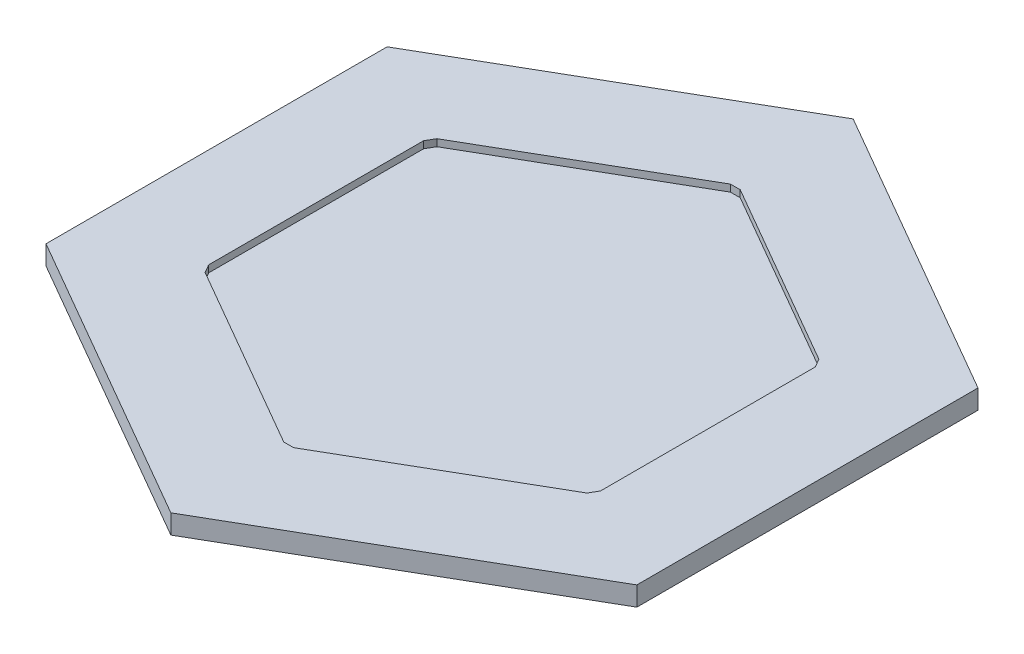
ISO-10303-21;
HEADER;
FILE_DESCRIPTION(('STEP AP214'),'2;1');
FILE_NAME('part.step','',(''),(''),'','','');
FILE_SCHEMA(('AUTOMOTIVE_DESIGN { 1 0 10303 214 1 1 1 1 }'));
ENDSEC;
DATA;
#1=APPLICATION_CONTEXT('core data for automotive mechanical design processes');
#2=APPLICATION_PROTOCOL_DEFINITION('international standard','automotive_design',2000,#1);
#3=PRODUCT_CONTEXT('',#1,'mechanical');
#4=PRODUCT('Part','Part','',(#3));
#5=PRODUCT_RELATED_PRODUCT_CATEGORY('part','',(#4));
#6=PRODUCT_DEFINITION_FORMATION('','',#4);
#7=PRODUCT_DEFINITION_CONTEXT('part definition',#1,'design');
#8=PRODUCT_DEFINITION('design','',#6,#7);
#9=PRODUCT_DEFINITION_SHAPE('','',#8);
#10=(LENGTH_UNIT() NAMED_UNIT(*) SI_UNIT(.MILLI.,.METRE.));
#11=(NAMED_UNIT(*) PLANE_ANGLE_UNIT() SI_UNIT($,.RADIAN.));
#12=(NAMED_UNIT(*) SI_UNIT($,.STERADIAN.) SOLID_ANGLE_UNIT());
#13=UNCERTAINTY_MEASURE_WITH_UNIT(LENGTH_MEASURE(1.E-05),#10,'distance_accuracy_value','');
#14=(GEOMETRIC_REPRESENTATION_CONTEXT(3) GLOBAL_UNCERTAINTY_ASSIGNED_CONTEXT((#13)) GLOBAL_UNIT_ASSIGNED_CONTEXT((#10,
#11,#12)) REPRESENTATION_CONTEXT('',''));
#15=CARTESIAN_POINT('',(0.,0.,0.));
#16=DIRECTION('',(0.,0.,1.));
#17=DIRECTION('',(1.,0.,0.));
#18=AXIS2_PLACEMENT_3D('',#15,#16,#17);
#19=CARTESIAN_POINT('',(0.,1.7,0.));
#20=DIRECTION('',(0.,1.,0.));
#21=DIRECTION('',(0.,0.,1.));
#22=AXIS2_PLACEMENT_3D('',#19,#20,#21);
#23=PLANE('',#22);
#24=DIRECTION('',(0.866025403784438,0.,0.5));
#25=VECTOR('',#24,1.);
#26=CARTESIAN_POINT('',(-71.9615242270663,1.7,41.5470053837925));
#27=LINE('',#26,#25);
#28=CARTESIAN_POINT('',(-71.9615242270663,1.7,41.5470053837925));
#29=VERTEX_POINT('',#28);
#30=CARTESIAN_POINT('',(0.,1.7,83.094010767585));
#31=VERTEX_POINT('',#30);
#32=EDGE_CURVE('E327',#29,#31,#27,.T.);
#33=ORIENTED_EDGE('',*,*,#32,.T.);
#34=DIRECTION('',(0.866025403784439,0.,-0.5));
#35=VECTOR('',#34,1.);
#36=CARTESIAN_POINT('',(0.,1.7,83.094010767585));
#37=LINE('',#36,#35);
#38=CARTESIAN_POINT('',(71.9615242270663,1.7,41.5470053837925));
#39=VERTEX_POINT('',#38);
#40=EDGE_CURVE('E176',#31,#39,#37,.T.);
#41=ORIENTED_EDGE('',*,*,#40,.T.);
#42=DIRECTION('',(0.,0.,-1.));
#43=VECTOR('',#42,1.);
#44=CARTESIAN_POINT('',(71.9615242270663,1.7,41.5470053837925));
#45=LINE('',#44,#43);
#46=CARTESIAN_POINT('',(71.9615242270663,1.7,-41.5470053837925));
#47=VERTEX_POINT('',#46);
#48=EDGE_CURVE('E332',#39,#47,#45,.T.);
#49=ORIENTED_EDGE('',*,*,#48,.T.);
#50=DIRECTION('',(-0.866025403784439,0.,-0.5));
#51=VECTOR('',#50,1.);
#52=CARTESIAN_POINT('',(71.9615242270663,1.7,-41.5470053837925));
#53=LINE('',#52,#51);
#54=CARTESIAN_POINT('',(0.,1.7,-83.094010767585));
#55=VERTEX_POINT('',#54);
#56=EDGE_CURVE('E335',#47,#55,#53,.T.);
#57=ORIENTED_EDGE('',*,*,#56,.T.);
#58=DIRECTION('',(-0.866025403784439,0.,0.5));
#59=VECTOR('',#58,1.);
#60=CARTESIAN_POINT('',(0.,1.7,-83.094010767585));
#61=LINE('',#60,#59);
#62=CARTESIAN_POINT('',(-71.9615242270663,1.7,-41.5470053837925));
#63=VERTEX_POINT('',#62);
#64=EDGE_CURVE('E338',#55,#63,#61,.T.);
#65=ORIENTED_EDGE('',*,*,#64,.T.);
#66=DIRECTION('',(0.,0.,1.));
#67=VECTOR('',#66,1.);
#68=CARTESIAN_POINT('',(-71.9615242270663,1.7,-41.5470053837925));
#69=LINE('',#68,#67);
#70=EDGE_CURVE('E69',#63,#29,#69,.T.);
#71=ORIENTED_EDGE('',*,*,#70,.T.);
#72=EDGE_LOOP('',(#33,#41,#49,#57,#65,#71));
#73=FACE_BOUND('',#72,.T.);
#74=DIRECTION('',(-0.866025403784438,0.,0.5));
#75=VECTOR('',#74,1.);
#76=CARTESIAN_POINT('',(-1.19253766915104,1.7,-54.4040107675851));
#77=LINE('',#76,#75);
#78=CARTESIAN_POINT('',(-1.19253766915104,1.7,-54.4040107675851));
#79=VERTEX_POINT('',#78);
#80=CARTESIAN_POINT('',(-46.5189865579153,1.7,-28.2347733002472));
#81=VERTEX_POINT('',#80);
#82=EDGE_CURVE('E211',#79,#81,#77,.T.);
#83=ORIENTED_EDGE('',*,*,#82,.F.);
#84=DIRECTION('',(-1.,0.,0.));
#85=VECTOR('',#84,1.);
#86=CARTESIAN_POINT('',(1.19253766915092,1.7,-54.4040107675851));
#87=LINE('',#86,#85);
#88=CARTESIAN_POINT('',(1.19253766915092,1.7,-54.4040107675851));
#89=VERTEX_POINT('',#88);
#90=EDGE_CURVE('E208',#89,#79,#87,.T.);
#91=ORIENTED_EDGE('',*,*,#90,.F.);
#92=DIRECTION('',(-0.866025403784439,0.,-0.5));
#93=VECTOR('',#92,1.);
#94=CARTESIAN_POINT('',(46.5189865579153,1.7,-28.2347733002472));
#95=LINE('',#94,#93);
#96=CARTESIAN_POINT('',(46.5189865579153,1.7,-28.2347733002472));
#97=VERTEX_POINT('',#96);
#98=EDGE_CURVE('E242',#97,#89,#95,.T.);
#99=ORIENTED_EDGE('',*,*,#98,.F.);
#100=DIRECTION('',(-0.499999999999998,0.,-0.86602540378444));
#101=VECTOR('',#100,1.);
#102=CARTESIAN_POINT('',(47.7115242270663,1.7,-26.1692374673379));
#103=LINE('',#102,#101);
#104=CARTESIAN_POINT('',(47.7115242270663,1.7,-26.1692374673379));
#105=VERTEX_POINT('',#104);
#106=EDGE_CURVE('E239',#105,#97,#103,.T.);
#107=ORIENTED_EDGE('',*,*,#106,.F.);
#108=DIRECTION('',(0.,0.,-1.));
#109=VECTOR('',#108,1.);
#110=CARTESIAN_POINT('',(47.7115242270663,1.7,26.1692374673379));
#111=LINE('',#110,#109);
#112=CARTESIAN_POINT('',(47.7115242270663,1.7,26.1692374673379));
#113=VERTEX_POINT('',#112);
#114=EDGE_CURVE('E236',#113,#105,#111,.T.);
#115=ORIENTED_EDGE('',*,*,#114,.F.);
#116=DIRECTION('',(0.49999999999999,0.,-0.866025403784444));
#117=VECTOR('',#116,1.);
#118=CARTESIAN_POINT('',(46.5189865579153,1.7,28.2347733002472));
#119=LINE('',#118,#117);
#120=CARTESIAN_POINT('',(46.5189865579153,1.7,28.2347733002472));
#121=VERTEX_POINT('',#120);
#122=EDGE_CURVE('E233',#121,#113,#119,.T.);
#123=ORIENTED_EDGE('',*,*,#122,.F.);
#124=DIRECTION('',(0.866025403784439,0.,-0.5));
#125=VECTOR('',#124,1.);
#126=CARTESIAN_POINT('',(1.19253766915103,1.7,54.4040107675851));
#127=LINE('',#126,#125);
#128=CARTESIAN_POINT('',(1.19253766915103,1.7,54.4040107675851));
#129=VERTEX_POINT('',#128);
#130=EDGE_CURVE('E230',#129,#121,#127,.T.);
#131=ORIENTED_EDGE('',*,*,#130,.F.);
#132=DIRECTION('',(1.,0.,0.));
#133=VECTOR('',#132,1.);
#134=CARTESIAN_POINT('',(-1.19253766915094,1.7,54.4040107675851));
#135=LINE('',#134,#133);
#136=CARTESIAN_POINT('',(-1.19253766915094,1.7,54.4040107675851));
#137=VERTEX_POINT('',#136);
#138=EDGE_CURVE('E227',#137,#129,#135,.T.);
#139=ORIENTED_EDGE('',*,*,#138,.F.);
#140=DIRECTION('',(0.866025403784439,0.,0.5));
#141=VECTOR('',#140,1.);
#142=CARTESIAN_POINT('',(-46.5189865579153,1.7,28.2347733002472));
#143=LINE('',#142,#141);
#144=CARTESIAN_POINT('',(-46.5189865579153,1.7,28.2347733002472));
#145=VERTEX_POINT('',#144);
#146=EDGE_CURVE('E224',#145,#137,#143,.T.);
#147=ORIENTED_EDGE('',*,*,#146,.F.);
#148=DIRECTION('',(0.500000000000009,0.,0.866025403784433));
#149=VECTOR('',#148,1.);
#150=CARTESIAN_POINT('',(-47.7115242270663,1.7,26.1692374673379));
#151=LINE('',#150,#149);
#152=CARTESIAN_POINT('',(-47.7115242270663,1.7,26.1692374673379));
#153=VERTEX_POINT('',#152);
#154=EDGE_CURVE('E221',#153,#145,#151,.T.);
#155=ORIENTED_EDGE('',*,*,#154,.F.);
#156=DIRECTION('',(0.,0.,1.));
#157=VECTOR('',#156,1.);
#158=CARTESIAN_POINT('',(-47.7115242270663,1.7,-26.1692374673379));
#159=LINE('',#158,#157);
#160=CARTESIAN_POINT('',(-47.7115242270663,1.7,-26.1692374673379));
#161=VERTEX_POINT('',#160);
#162=EDGE_CURVE('E218',#161,#153,#159,.T.);
#163=ORIENTED_EDGE('',*,*,#162,.F.);
#164=DIRECTION('',(-0.499999999999995,0.,0.866025403784441));
#165=VECTOR('',#164,1.);
#166=CARTESIAN_POINT('',(-46.5189865579153,1.7,-28.2347733002472));
#167=LINE('',#166,#165);
#168=EDGE_CURVE('E215',#81,#161,#167,.T.);
#169=ORIENTED_EDGE('',*,*,#168,.F.);
#170=EDGE_LOOP('',(#83,#91,#99,#107,#115,#123,#131,#139,#147,#155,#163,#169));
#171=FACE_BOUND('',#170,.T.);
#172=ADVANCED_FACE('F45',(#73,#171),#23,.T.);
#173=CARTESIAN_POINT('',(-71.9615242270663,1.7,41.5470053837925));
#174=DIRECTION('',(0.5,0.,-0.866025403784439));
#175=DIRECTION('',(-0.866025403784439,0.,-0.5));
#176=AXIS2_PLACEMENT_3D('',#173,#174,#175);
#177=PLANE('',#176);
#178=DIRECTION('',(0.,-1.,0.));
#179=VECTOR('',#178,1.);
#180=CARTESIAN_POINT('',(-71.9615242270663,1.7,41.5470053837925));
#181=LINE('',#180,#179);
#182=CARTESIAN_POINT('',(-71.9615242270663,-3.,41.5470053837925));
#183=VERTEX_POINT('',#182);
#184=EDGE_CURVE('E181',#29,#183,#181,.T.);
#185=ORIENTED_EDGE('',*,*,#184,.T.);
#186=DIRECTION('',(-0.866025403784438,0.,-0.5));
#187=VECTOR('',#186,1.);
#188=CARTESIAN_POINT('',(0.,-3.,83.094010767585));
#189=LINE('',#188,#187);
#190=CARTESIAN_POINT('',(0.,-3.,83.094010767585));
#191=VERTEX_POINT('',#190);
#192=EDGE_CURVE('E180',#191,#183,#189,.T.);
#193=ORIENTED_EDGE('',*,*,#192,.F.);
#194=DIRECTION('',(0.,-1.,0.));
#195=VECTOR('',#194,1.);
#196=CARTESIAN_POINT('',(0.,1.7,83.094010767585));
#197=LINE('',#196,#195);
#198=EDGE_CURVE('E11',#31,#191,#197,.T.);
#199=ORIENTED_EDGE('',*,*,#198,.F.);
#200=ORIENTED_EDGE('',*,*,#32,.F.);
#201=EDGE_LOOP('',(#185,#193,#199,#200));
#202=FACE_BOUND('',#201,.T.);
#203=ADVANCED_FACE('F47',(#202),#177,.F.);
#204=CARTESIAN_POINT('',(0.,1.7,83.094010767585));
#205=DIRECTION('',(-0.5,0.,-0.866025403784439));
#206=DIRECTION('',(-0.866025403784439,0.,0.5));
#207=AXIS2_PLACEMENT_3D('',#204,#205,#206);
#208=PLANE('',#207);
#209=ORIENTED_EDGE('',*,*,#198,.T.);
#210=DIRECTION('',(-0.866025403784439,0.,0.5));
#211=VECTOR('',#210,1.);
#212=CARTESIAN_POINT('',(71.9615242270663,-3.,41.5470053837925));
#213=LINE('',#212,#211);
#214=CARTESIAN_POINT('',(71.9615242270663,-3.,41.5470053837925));
#215=VERTEX_POINT('',#214);
#216=EDGE_CURVE('E175',#215,#191,#213,.T.);
#217=ORIENTED_EDGE('',*,*,#216,.F.);
#218=DIRECTION('',(0.,-1.,0.));
#219=VECTOR('',#218,1.);
#220=CARTESIAN_POINT('',(71.9615242270663,1.7,41.5470053837925));
#221=LINE('',#220,#219);
#222=EDGE_CURVE('E54',#39,#215,#221,.T.);
#223=ORIENTED_EDGE('',*,*,#222,.F.);
#224=ORIENTED_EDGE('',*,*,#40,.F.);
#225=EDGE_LOOP('',(#209,#217,#223,#224));
#226=FACE_BOUND('',#225,.T.);
#227=ADVANCED_FACE('F172',(#226),#208,.F.);
#228=CARTESIAN_POINT('',(71.9615242270663,1.7,41.5470053837925));
#229=DIRECTION('',(-1.,0.,0.));
#230=DIRECTION('',(0.,0.,1.));
#231=AXIS2_PLACEMENT_3D('',#228,#229,#230);
#232=PLANE('',#231);
#233=ORIENTED_EDGE('',*,*,#222,.T.);
#234=DIRECTION('',(0.,0.,1.));
#235=VECTOR('',#234,1.);
#236=CARTESIAN_POINT('',(71.9615242270663,-3.,-41.5470053837925));
#237=LINE('',#236,#235);
#238=CARTESIAN_POINT('',(71.9615242270663,-3.,-41.5470053837925));
#239=VERTEX_POINT('',#238);
#240=EDGE_CURVE('E192',#239,#215,#237,.T.);
#241=ORIENTED_EDGE('',*,*,#240,.F.);
#242=DIRECTION('',(0.,-1.,0.));
#243=VECTOR('',#242,1.);
#244=CARTESIAN_POINT('',(71.9615242270663,1.7,-41.5470053837925));
#245=LINE('',#244,#243);
#246=EDGE_CURVE('E351',#47,#239,#245,.T.);
#247=ORIENTED_EDGE('',*,*,#246,.F.);
#248=ORIENTED_EDGE('',*,*,#48,.F.);
#249=EDGE_LOOP('',(#233,#241,#247,#248));
#250=FACE_BOUND('',#249,.T.);
#251=ADVANCED_FACE('F356',(#250),#232,.F.);
#252=CARTESIAN_POINT('',(71.9615242270663,1.7,-41.5470053837925));
#253=DIRECTION('',(-0.5,0.,0.866025403784439));
#254=DIRECTION('',(0.866025403784439,0.,0.5));
#255=AXIS2_PLACEMENT_3D('',#252,#253,#254);
#256=PLANE('',#255);
#257=ORIENTED_EDGE('',*,*,#246,.T.);
#258=DIRECTION('',(0.866025403784439,0.,0.5));
#259=VECTOR('',#258,1.);
#260=CARTESIAN_POINT('',(0.,-3.,-83.094010767585));
#261=LINE('',#260,#259);
#262=CARTESIAN_POINT('',(0.,-3.,-83.094010767585));
#263=VERTEX_POINT('',#262);
#264=EDGE_CURVE('E202',#263,#239,#261,.T.);
#265=ORIENTED_EDGE('',*,*,#264,.F.);
#266=DIRECTION('',(0.,-1.,0.));
#267=VECTOR('',#266,1.);
#268=CARTESIAN_POINT('',(0.,1.7,-83.094010767585));
#269=LINE('',#268,#267);
#270=EDGE_CURVE('E348',#55,#263,#269,.T.);
#271=ORIENTED_EDGE('',*,*,#270,.F.);
#272=ORIENTED_EDGE('',*,*,#56,.F.);
#273=EDGE_LOOP('',(#257,#265,#271,#272));
#274=FACE_BOUND('',#273,.T.);
#275=ADVANCED_FACE('F365',(#274),#256,.F.);
#276=CARTESIAN_POINT('',(0.,1.7,-83.094010767585));
#277=DIRECTION('',(0.5,0.,0.866025403784439));
#278=DIRECTION('',(0.866025403784439,0.,-0.5));
#279=AXIS2_PLACEMENT_3D('',#276,#277,#278);
#280=PLANE('',#279);
#281=ORIENTED_EDGE('',*,*,#270,.T.);
#282=DIRECTION('',(0.866025403784439,0.,-0.5));
#283=VECTOR('',#282,1.);
#284=CARTESIAN_POINT('',(-71.9615242270663,-3.,-41.5470053837925));
#285=LINE('',#284,#283);
#286=CARTESIAN_POINT('',(-71.9615242270663,-3.,-41.5470053837925));
#287=VERTEX_POINT('',#286);
#288=EDGE_CURVE('E198',#287,#263,#285,.T.);
#289=ORIENTED_EDGE('',*,*,#288,.F.);
#290=DIRECTION('',(0.,-1.,0.));
#291=VECTOR('',#290,1.);
#292=CARTESIAN_POINT('',(-71.9615242270663,1.7,-41.5470053837925));
#293=LINE('',#292,#291);
#294=EDGE_CURVE('E345',#63,#287,#293,.T.);
#295=ORIENTED_EDGE('',*,*,#294,.F.);
#296=ORIENTED_EDGE('',*,*,#64,.F.);
#297=EDGE_LOOP('',(#281,#289,#295,#296));
#298=FACE_BOUND('',#297,.T.);
#299=ADVANCED_FACE('F368',(#298),#280,.F.);
#300=CARTESIAN_POINT('',(-71.9615242270663,1.7,-41.5470053837925));
#301=DIRECTION('',(1.,0.,0.));
#302=DIRECTION('',(0.,0.,-1.));
#303=AXIS2_PLACEMENT_3D('',#300,#301,#302);
#304=PLANE('',#303);
#305=ORIENTED_EDGE('',*,*,#294,.T.);
#306=DIRECTION('',(0.,0.,-1.));
#307=VECTOR('',#306,1.);
#308=CARTESIAN_POINT('',(-71.9615242270663,-3.,41.5470053837925));
#309=LINE('',#308,#307);
#310=EDGE_CURVE('E186',#183,#287,#309,.T.);
#311=ORIENTED_EDGE('',*,*,#310,.F.);
#312=ORIENTED_EDGE('',*,*,#184,.F.);
#313=ORIENTED_EDGE('',*,*,#70,.F.);
#314=EDGE_LOOP('',(#305,#311,#312,#313));
#315=FACE_BOUND('',#314,.T.);
#316=ADVANCED_FACE('F370',(#315),#304,.F.);
#317=CARTESIAN_POINT('',(1.19253766915092,1.7,-54.4040107675851));
#318=DIRECTION('',(0.,0.,1.));
#319=DIRECTION('',(1.,0.,0.));
#320=AXIS2_PLACEMENT_3D('',#317,#318,#319);
#321=PLANE('',#320);
#322=DIRECTION('',(-1.,0.,0.));
#323=VECTOR('',#322,1.);
#324=CARTESIAN_POINT('',(1.19253766915092,0.,-54.4040107675851));
#325=LINE('',#324,#323);
#326=CARTESIAN_POINT('',(1.19253766915092,0.,-54.4040107675851));
#327=VERTEX_POINT('',#326);
#328=CARTESIAN_POINT('',(-1.19253766915104,0.,-54.4040107675851));
#329=VERTEX_POINT('',#328);
#330=EDGE_CURVE('E207',#327,#329,#325,.T.);
#331=ORIENTED_EDGE('',*,*,#330,.F.);
#332=DIRECTION('',(0.,-1.,0.));
#333=VECTOR('',#332,1.);
#334=CARTESIAN_POINT('',(1.19253766915092,1.7,-54.4040107675851));
#335=LINE('',#334,#333);
#336=EDGE_CURVE('E245',#89,#327,#335,.T.);
#337=ORIENTED_EDGE('',*,*,#336,.F.);
#338=ORIENTED_EDGE('',*,*,#90,.T.);
#339=DIRECTION('',(0.,-1.,0.));
#340=VECTOR('',#339,1.);
#341=CARTESIAN_POINT('',(-1.19253766915104,1.7,-54.4040107675851));
#342=LINE('',#341,#340);
#343=EDGE_CURVE('E323',#79,#329,#342,.T.);
#344=ORIENTED_EDGE('',*,*,#343,.T.);
#345=EDGE_LOOP('',(#331,#337,#338,#344));
#346=FACE_BOUND('',#345,.T.);
#347=ADVANCED_FACE('F372',(#346),#321,.T.);
#348=CARTESIAN_POINT('',(-1.19253766915104,1.7,-54.4040107675851));
#349=DIRECTION('',(0.5,0.,0.866025403784438));
#350=DIRECTION('',(0.866025403784439,0.,-0.5));
#351=AXIS2_PLACEMENT_3D('',#348,#349,#350);
#352=PLANE('',#351);
#353=DIRECTION('',(-0.866025403784438,0.,0.5));
#354=VECTOR('',#353,1.);
#355=CARTESIAN_POINT('',(-1.19253766915104,0.,-54.4040107675851));
#356=LINE('',#355,#354);
#357=CARTESIAN_POINT('',(-46.5189865579153,0.,-28.2347733002472));
#358=VERTEX_POINT('',#357);
#359=EDGE_CURVE('E249',#329,#358,#356,.T.);
#360=ORIENTED_EDGE('',*,*,#359,.F.);
#361=ORIENTED_EDGE('',*,*,#343,.F.);
#362=ORIENTED_EDGE('',*,*,#82,.T.);
#363=DIRECTION('',(0.,-1.,0.));
#364=VECTOR('',#363,1.);
#365=CARTESIAN_POINT('',(-46.5189865579153,1.7,-28.2347733002472));
#366=LINE('',#365,#364);
#367=EDGE_CURVE('E320',#81,#358,#366,.T.);
#368=ORIENTED_EDGE('',*,*,#367,.T.);
#369=EDGE_LOOP('',(#360,#361,#362,#368));
#370=FACE_BOUND('',#369,.T.);
#371=ADVANCED_FACE('F378',(#370),#352,.T.);
#372=CARTESIAN_POINT('',(-46.5189865579153,1.7,-28.2347733002472));
#373=DIRECTION('',(0.866025403784441,0.,0.499999999999995));
#374=DIRECTION('',(0.499999999999995,0.,-0.866025403784441));
#375=AXIS2_PLACEMENT_3D('',#372,#373,#374);
#376=PLANE('',#375);
#377=DIRECTION('',(-0.499999999999995,0.,0.866025403784441));
#378=VECTOR('',#377,1.);
#379=CARTESIAN_POINT('',(-46.5189865579153,0.,-28.2347733002472));
#380=LINE('',#379,#378);
#381=CARTESIAN_POINT('',(-47.7115242270663,0.,-26.1692374673379));
#382=VERTEX_POINT('',#381);
#383=EDGE_CURVE('E253',#358,#382,#380,.T.);
#384=ORIENTED_EDGE('',*,*,#383,.F.);
#385=ORIENTED_EDGE('',*,*,#367,.F.);
#386=ORIENTED_EDGE('',*,*,#168,.T.);
#387=DIRECTION('',(0.,-1.,0.));
#388=VECTOR('',#387,1.);
#389=CARTESIAN_POINT('',(-47.7115242270663,1.7,-26.1692374673379));
#390=LINE('',#389,#388);
#391=EDGE_CURVE('E317',#161,#382,#390,.T.);
#392=ORIENTED_EDGE('',*,*,#391,.T.);
#393=EDGE_LOOP('',(#384,#385,#386,#392));
#394=FACE_BOUND('',#393,.T.);
#395=ADVANCED_FACE('F390',(#394),#376,.T.);
#396=CARTESIAN_POINT('',(-47.7115242270663,1.7,-26.1692374673379));
#397=DIRECTION('',(1.,0.,0.));
#398=DIRECTION('',(0.,0.,-1.));
#399=AXIS2_PLACEMENT_3D('',#396,#397,#398);
#400=PLANE('',#399);
#401=DIRECTION('',(0.,0.,1.));
#402=VECTOR('',#401,1.);
#403=CARTESIAN_POINT('',(-47.7115242270663,0.,-26.1692374673379));
#404=LINE('',#403,#402);
#405=CARTESIAN_POINT('',(-47.7115242270663,0.,26.1692374673379));
#406=VERTEX_POINT('',#405);
#407=EDGE_CURVE('E257',#382,#406,#404,.T.);
#408=ORIENTED_EDGE('',*,*,#407,.F.);
#409=ORIENTED_EDGE('',*,*,#391,.F.);
#410=ORIENTED_EDGE('',*,*,#162,.T.);
#411=DIRECTION('',(0.,-1.,0.));
#412=VECTOR('',#411,1.);
#413=CARTESIAN_POINT('',(-47.7115242270663,1.7,26.1692374673379));
#414=LINE('',#413,#412);
#415=EDGE_CURVE('E314',#153,#406,#414,.T.);
#416=ORIENTED_EDGE('',*,*,#415,.T.);
#417=EDGE_LOOP('',(#408,#409,#410,#416));
#418=FACE_BOUND('',#417,.T.);
#419=ADVANCED_FACE('F394',(#418),#400,.T.);
#420=CARTESIAN_POINT('',(-47.7115242270663,1.7,26.1692374673379));
#421=DIRECTION('',(0.866025403784433,0.,-0.500000000000009));
#422=DIRECTION('',(-0.500000000000009,0.,-0.866025403784433));
#423=AXIS2_PLACEMENT_3D('',#420,#421,#422);
#424=PLANE('',#423);
#425=DIRECTION('',(0.500000000000009,0.,0.866025403784433));
#426=VECTOR('',#425,1.);
#427=CARTESIAN_POINT('',(-47.7115242270663,0.,26.1692374673379));
#428=LINE('',#427,#426);
#429=CARTESIAN_POINT('',(-46.5189865579153,0.,28.2347733002472));
#430=VERTEX_POINT('',#429);
#431=EDGE_CURVE('E261',#406,#430,#428,.T.);
#432=ORIENTED_EDGE('',*,*,#431,.F.);
#433=ORIENTED_EDGE('',*,*,#415,.F.);
#434=ORIENTED_EDGE('',*,*,#154,.T.);
#435=DIRECTION('',(0.,-1.,0.));
#436=VECTOR('',#435,1.);
#437=CARTESIAN_POINT('',(-46.5189865579153,1.7,28.2347733002472));
#438=LINE('',#437,#436);
#439=EDGE_CURVE('E311',#145,#430,#438,.T.);
#440=ORIENTED_EDGE('',*,*,#439,.T.);
#441=EDGE_LOOP('',(#432,#433,#434,#440));
#442=FACE_BOUND('',#441,.T.);
#443=ADVANCED_FACE('F398',(#442),#424,.T.);
#444=CARTESIAN_POINT('',(-46.5189865579153,1.7,28.2347733002472));
#445=DIRECTION('',(0.5,0.,-0.866025403784439));
#446=DIRECTION('',(-0.866025403784439,0.,-0.5));
#447=AXIS2_PLACEMENT_3D('',#444,#445,#446);
#448=PLANE('',#447);
#449=DIRECTION('',(0.866025403784439,0.,0.5));
#450=VECTOR('',#449,1.);
#451=CARTESIAN_POINT('',(-46.5189865579153,0.,28.2347733002472));
#452=LINE('',#451,#450);
#453=CARTESIAN_POINT('',(-1.19253766915094,0.,54.4040107675851));
#454=VERTEX_POINT('',#453);
#455=EDGE_CURVE('E265',#430,#454,#452,.T.);
#456=ORIENTED_EDGE('',*,*,#455,.F.);
#457=ORIENTED_EDGE('',*,*,#439,.F.);
#458=ORIENTED_EDGE('',*,*,#146,.T.);
#459=DIRECTION('',(0.,-1.,0.));
#460=VECTOR('',#459,1.);
#461=CARTESIAN_POINT('',(-1.19253766915094,1.7,54.4040107675851));
#462=LINE('',#461,#460);
#463=EDGE_CURVE('E308',#137,#454,#462,.T.);
#464=ORIENTED_EDGE('',*,*,#463,.T.);
#465=EDGE_LOOP('',(#456,#457,#458,#464));
#466=FACE_BOUND('',#465,.T.);
#467=ADVANCED_FACE('F402',(#466),#448,.T.);
#468=CARTESIAN_POINT('',(-1.19253766915094,1.7,54.4040107675851));
#469=DIRECTION('',(0.,0.,-1.));
#470=DIRECTION('',(-1.,0.,0.));
#471=AXIS2_PLACEMENT_3D('',#468,#469,#470);
#472=PLANE('',#471);
#473=DIRECTION('',(1.,0.,0.));
#474=VECTOR('',#473,1.);
#475=CARTESIAN_POINT('',(-1.19253766915094,0.,54.4040107675851));
#476=LINE('',#475,#474);
#477=CARTESIAN_POINT('',(1.19253766915103,0.,54.4040107675851));
#478=VERTEX_POINT('',#477);
#479=EDGE_CURVE('E269',#454,#478,#476,.T.);
#480=ORIENTED_EDGE('',*,*,#479,.F.);
#481=ORIENTED_EDGE('',*,*,#463,.F.);
#482=ORIENTED_EDGE('',*,*,#138,.T.);
#483=DIRECTION('',(0.,-1.,0.));
#484=VECTOR('',#483,1.);
#485=CARTESIAN_POINT('',(1.19253766915103,1.7,54.4040107675851));
#486=LINE('',#485,#484);
#487=EDGE_CURVE('E305',#129,#478,#486,.T.);
#488=ORIENTED_EDGE('',*,*,#487,.T.);
#489=EDGE_LOOP('',(#480,#481,#482,#488));
#490=FACE_BOUND('',#489,.T.);
#491=ADVANCED_FACE('F406',(#490),#472,.T.);
#492=CARTESIAN_POINT('',(1.19253766915103,1.7,54.4040107675851));
#493=DIRECTION('',(-0.5,0.,-0.866025403784439));
#494=DIRECTION('',(-0.866025403784439,0.,0.5));
#495=AXIS2_PLACEMENT_3D('',#492,#493,#494);
#496=PLANE('',#495);
#497=DIRECTION('',(0.866025403784439,0.,-0.5));
#498=VECTOR('',#497,1.);
#499=CARTESIAN_POINT('',(1.19253766915103,0.,54.4040107675851));
#500=LINE('',#499,#498);
#501=CARTESIAN_POINT('',(46.5189865579153,0.,28.2347733002472));
#502=VERTEX_POINT('',#501);
#503=EDGE_CURVE('E273',#478,#502,#500,.T.);
#504=ORIENTED_EDGE('',*,*,#503,.F.);
#505=ORIENTED_EDGE('',*,*,#487,.F.);
#506=ORIENTED_EDGE('',*,*,#130,.T.);
#507=DIRECTION('',(0.,-1.,0.));
#508=VECTOR('',#507,1.);
#509=CARTESIAN_POINT('',(46.5189865579153,1.7,28.2347733002472));
#510=LINE('',#509,#508);
#511=EDGE_CURVE('E302',#121,#502,#510,.T.);
#512=ORIENTED_EDGE('',*,*,#511,.T.);
#513=EDGE_LOOP('',(#504,#505,#506,#512));
#514=FACE_BOUND('',#513,.T.);
#515=ADVANCED_FACE('F410',(#514),#496,.T.);
#516=CARTESIAN_POINT('',(46.5189865579153,1.7,28.2347733002472));
#517=DIRECTION('',(-0.866025403784444,0.,-0.49999999999999));
#518=DIRECTION('',(-0.49999999999999,0.,0.866025403784444));
#519=AXIS2_PLACEMENT_3D('',#516,#517,#518);
#520=PLANE('',#519);
#521=DIRECTION('',(0.49999999999999,0.,-0.866025403784444));
#522=VECTOR('',#521,1.);
#523=CARTESIAN_POINT('',(46.5189865579153,0.,28.2347733002472));
#524=LINE('',#523,#522);
#525=CARTESIAN_POINT('',(47.7115242270663,0.,26.1692374673379));
#526=VERTEX_POINT('',#525);
#527=EDGE_CURVE('E277',#502,#526,#524,.T.);
#528=ORIENTED_EDGE('',*,*,#527,.F.);
#529=ORIENTED_EDGE('',*,*,#511,.F.);
#530=ORIENTED_EDGE('',*,*,#122,.T.);
#531=DIRECTION('',(0.,-1.,0.));
#532=VECTOR('',#531,1.);
#533=CARTESIAN_POINT('',(47.7115242270663,1.7,26.1692374673379));
#534=LINE('',#533,#532);
#535=EDGE_CURVE('E299',#113,#526,#534,.T.);
#536=ORIENTED_EDGE('',*,*,#535,.T.);
#537=EDGE_LOOP('',(#528,#529,#530,#536));
#538=FACE_BOUND('',#537,.T.);
#539=ADVANCED_FACE('F414',(#538),#520,.T.);
#540=CARTESIAN_POINT('',(47.7115242270663,1.7,26.1692374673379));
#541=DIRECTION('',(-1.,0.,0.));
#542=DIRECTION('',(0.,0.,1.));
#543=AXIS2_PLACEMENT_3D('',#540,#541,#542);
#544=PLANE('',#543);
#545=DIRECTION('',(0.,0.,-1.));
#546=VECTOR('',#545,1.);
#547=CARTESIAN_POINT('',(47.7115242270663,0.,26.1692374673379));
#548=LINE('',#547,#546);
#549=CARTESIAN_POINT('',(47.7115242270663,0.,-26.1692374673379));
#550=VERTEX_POINT('',#549);
#551=EDGE_CURVE('E281',#526,#550,#548,.T.);
#552=ORIENTED_EDGE('',*,*,#551,.F.);
#553=ORIENTED_EDGE('',*,*,#535,.F.);
#554=ORIENTED_EDGE('',*,*,#114,.T.);
#555=DIRECTION('',(0.,-1.,0.));
#556=VECTOR('',#555,1.);
#557=CARTESIAN_POINT('',(47.7115242270663,1.7,-26.1692374673379));
#558=LINE('',#557,#556);
#559=EDGE_CURVE('E296',#105,#550,#558,.T.);
#560=ORIENTED_EDGE('',*,*,#559,.T.);
#561=EDGE_LOOP('',(#552,#553,#554,#560));
#562=FACE_BOUND('',#561,.T.);
#563=ADVANCED_FACE('F418',(#562),#544,.T.);
#564=CARTESIAN_POINT('',(47.7115242270663,1.7,-26.1692374673379));
#565=DIRECTION('',(-0.86602540378444,0.,0.499999999999998));
#566=DIRECTION('',(0.499999999999998,0.,0.86602540378444));
#567=AXIS2_PLACEMENT_3D('',#564,#565,#566);
#568=PLANE('',#567);
#569=DIRECTION('',(-0.499999999999998,0.,-0.86602540378444));
#570=VECTOR('',#569,1.);
#571=CARTESIAN_POINT('',(47.7115242270663,0.,-26.1692374673379));
#572=LINE('',#571,#570);
#573=CARTESIAN_POINT('',(46.5189865579153,0.,-28.2347733002472));
#574=VERTEX_POINT('',#573);
#575=EDGE_CURVE('E285',#550,#574,#572,.T.);
#576=ORIENTED_EDGE('',*,*,#575,.F.);
#577=ORIENTED_EDGE('',*,*,#559,.F.);
#578=ORIENTED_EDGE('',*,*,#106,.T.);
#579=DIRECTION('',(0.,-1.,0.));
#580=VECTOR('',#579,1.);
#581=CARTESIAN_POINT('',(46.5189865579153,1.7,-28.2347733002472));
#582=LINE('',#581,#580);
#583=EDGE_CURVE('E61',#97,#574,#582,.T.);
#584=ORIENTED_EDGE('',*,*,#583,.T.);
#585=EDGE_LOOP('',(#576,#577,#578,#584));
#586=FACE_BOUND('',#585,.T.);
#587=ADVANCED_FACE('F422',(#586),#568,.T.);
#588=CARTESIAN_POINT('',(46.5189865579153,1.7,-28.2347733002472));
#589=DIRECTION('',(-0.5,0.,0.866025403784439));
#590=DIRECTION('',(0.866025403784439,0.,0.5));
#591=AXIS2_PLACEMENT_3D('',#588,#589,#590);
#592=PLANE('',#591);
#593=DIRECTION('',(-0.866025403784439,0.,-0.5));
#594=VECTOR('',#593,1.);
#595=CARTESIAN_POINT('',(46.5189865579153,0.,-28.2347733002472));
#596=LINE('',#595,#594);
#597=EDGE_CURVE('E212',#574,#327,#596,.T.);
#598=ORIENTED_EDGE('',*,*,#597,.F.);
#599=ORIENTED_EDGE('',*,*,#583,.F.);
#600=ORIENTED_EDGE('',*,*,#98,.T.);
#601=ORIENTED_EDGE('',*,*,#336,.T.);
#602=EDGE_LOOP('',(#598,#599,#600,#601));
#603=FACE_BOUND('',#602,.T.);
#604=ADVANCED_FACE('F426',(#603),#592,.T.);
#605=CARTESIAN_POINT('',(0.,0.,0.));
#606=DIRECTION('',(0.,-1.,0.));
#607=DIRECTION('',(0.,0.,-1.));
#608=AXIS2_PLACEMENT_3D('',#605,#606,#607);
#609=PLANE('',#608);
#610=ORIENTED_EDGE('',*,*,#597,.T.);
#611=ORIENTED_EDGE('',*,*,#330,.T.);
#612=ORIENTED_EDGE('',*,*,#359,.T.);
#613=ORIENTED_EDGE('',*,*,#383,.T.);
#614=ORIENTED_EDGE('',*,*,#407,.T.);
#615=ORIENTED_EDGE('',*,*,#431,.T.);
#616=ORIENTED_EDGE('',*,*,#455,.T.);
#617=ORIENTED_EDGE('',*,*,#479,.T.);
#618=ORIENTED_EDGE('',*,*,#503,.T.);
#619=ORIENTED_EDGE('',*,*,#527,.T.);
#620=ORIENTED_EDGE('',*,*,#551,.T.);
#621=ORIENTED_EDGE('',*,*,#575,.T.);
#622=EDGE_LOOP('',(#610,#611,#612,#613,#614,#615,#616,#617,#618,#619,#620,#621));
#623=FACE_BOUND('',#622,.T.);
#624=ADVANCED_FACE('F430',(#623),#609,.F.);
#625=CARTESIAN_POINT('',(0.,-3.,0.));
#626=DIRECTION('',(0.,-1.,0.));
#627=DIRECTION('',(0.,0.,-1.));
#628=AXIS2_PLACEMENT_3D('',#625,#626,#627);
#629=PLANE('',#628);
#630=ORIENTED_EDGE('',*,*,#216,.T.);
#631=ORIENTED_EDGE('',*,*,#192,.T.);
#632=ORIENTED_EDGE('',*,*,#310,.T.);
#633=ORIENTED_EDGE('',*,*,#288,.T.);
#634=ORIENTED_EDGE('',*,*,#264,.T.);
#635=ORIENTED_EDGE('',*,*,#240,.T.);
#636=EDGE_LOOP('',(#630,#631,#632,#633,#634,#635));
#637=FACE_BOUND('',#636,.T.);
#638=ADVANCED_FACE('F189',(#637),#629,.T.);
#639=CLOSED_SHELL('',(#172,#203,#227,#251,#275,#299,#316,#347,#371,#395,#419,#443,#467,#491,
#515,#539,#563,#587,#604,#624,#638));
#640=MANIFOLD_SOLID_BREP('B2',#639);
#641=ADVANCED_BREP_SHAPE_REPRESENTATION('',(#18,#640),#14);
#642=SHAPE_DEFINITION_REPRESENTATION(#9,#641);
ENDSEC;
END-ISO-10303-21;
